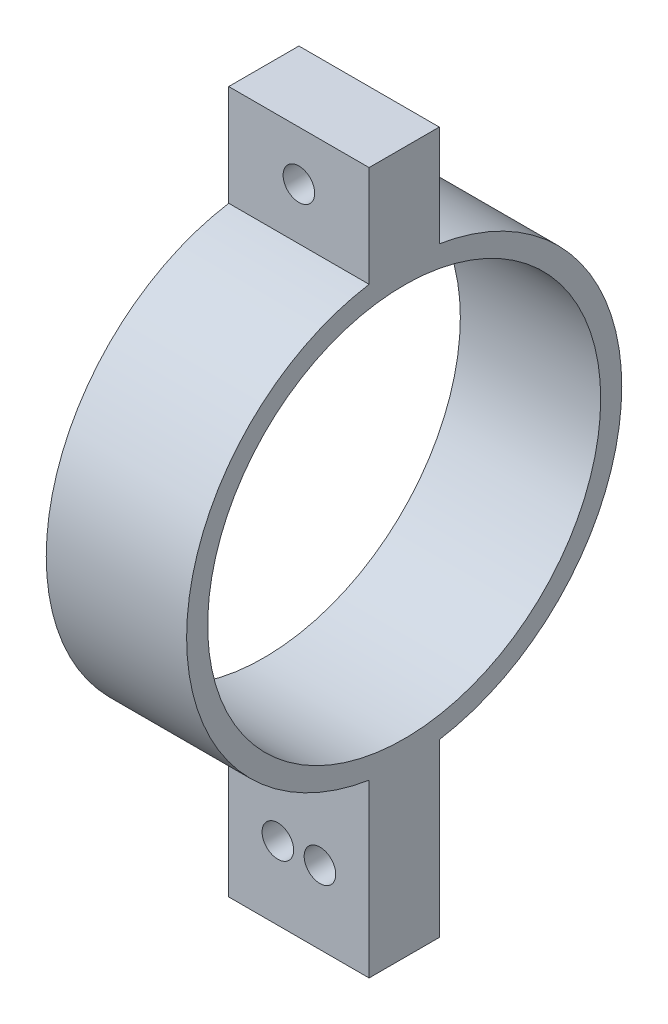
ISO-10303-21;
HEADER;
FILE_DESCRIPTION(('STEP AP214'),'2;1');
FILE_NAME('part.step','',(''),(''),'','','');
FILE_SCHEMA(('AUTOMOTIVE_DESIGN { 1 0 10303 214 1 1 1 1 }'));
ENDSEC;
DATA;
#1=APPLICATION_CONTEXT('core data for automotive mechanical design processes');
#2=APPLICATION_PROTOCOL_DEFINITION('international standard','automotive_design',2000,#1);
#3=PRODUCT_CONTEXT('',#1,'mechanical');
#4=PRODUCT('Part','Part','',(#3));
#5=PRODUCT_RELATED_PRODUCT_CATEGORY('part','',(#4));
#6=PRODUCT_DEFINITION_FORMATION('','',#4);
#7=PRODUCT_DEFINITION_CONTEXT('part definition',#1,'design');
#8=PRODUCT_DEFINITION('design','',#6,#7);
#9=PRODUCT_DEFINITION_SHAPE('','',#8);
#10=(LENGTH_UNIT() NAMED_UNIT(*) SI_UNIT(.MILLI.,.METRE.));
#11=(NAMED_UNIT(*) PLANE_ANGLE_UNIT() SI_UNIT($,.RADIAN.));
#12=(NAMED_UNIT(*) SI_UNIT($,.STERADIAN.) SOLID_ANGLE_UNIT());
#13=UNCERTAINTY_MEASURE_WITH_UNIT(LENGTH_MEASURE(1.E-05),#10,'distance_accuracy_value','');
#14=(GEOMETRIC_REPRESENTATION_CONTEXT(3) GLOBAL_UNCERTAINTY_ASSIGNED_CONTEXT((#13)) GLOBAL_UNIT_ASSIGNED_CONTEXT((#10,
#11,#12)) REPRESENTATION_CONTEXT('',''));
#15=CARTESIAN_POINT('',(0.,0.,0.));
#16=DIRECTION('',(0.,0.,1.));
#17=DIRECTION('',(1.,0.,0.));
#18=AXIS2_PLACEMENT_3D('',#15,#16,#17);
#19=CARTESIAN_POINT('',(20.,0.,0.));
#20=DIRECTION('',(-1.,0.,0.));
#21=DIRECTION('',(0.,0.,1.));
#22=AXIS2_PLACEMENT_3D('',#19,#20,#21);
#23=CYLINDRICAL_SURFACE('',#22,28.);
#24=CARTESIAN_POINT('',(0.,0.,0.));
#25=DIRECTION('',(1.,0.,0.));
#26=DIRECTION('',(0.,0.,-1.));
#27=AXIS2_PLACEMENT_3D('',#24,#25,#26);
#28=CIRCLE('',#27,28.);
#29=CARTESIAN_POINT('',(0.,0.,-28.));
#30=VERTEX_POINT('',#29);
#31=EDGE_CURVE('E163',#30,#30,#28,.T.);
#32=ORIENTED_EDGE('',*,*,#31,.F.);
#33=EDGE_LOOP('',(#32));
#34=FACE_BOUND('',#33,.T.);
#35=CARTESIAN_POINT('',(20.,0.,0.));
#36=DIRECTION('',(1.,0.,0.));
#37=DIRECTION('',(0.,0.,-1.));
#38=AXIS2_PLACEMENT_3D('',#35,#36,#37);
#39=CIRCLE('',#38,28.);
#40=CARTESIAN_POINT('',(20.,0.,-28.));
#41=VERTEX_POINT('',#40);
#42=EDGE_CURVE('E164',#41,#41,#39,.T.);
#43=ORIENTED_EDGE('',*,*,#42,.T.);
#44=EDGE_LOOP('',(#43));
#45=FACE_BOUND('',#44,.T.);
#46=ADVANCED_FACE('F40',(#34,#45),#23,.F.);
#47=CARTESIAN_POINT('',(20.,45.,0.));
#48=DIRECTION('',(0.,-1.,0.));
#49=DIRECTION('',(0.,0.,-1.));
#50=AXIS2_PLACEMENT_3D('',#47,#48,#49);
#51=PLANE('',#50);
#52=DIRECTION('',(0.,0.,1.));
#53=VECTOR('',#52,1.);
#54=CARTESIAN_POINT('',(0.,45.,0.));
#55=LINE('',#54,#53);
#56=CARTESIAN_POINT('',(0.,45.,-5.));
#57=VERTEX_POINT('',#56);
#58=CARTESIAN_POINT('',(0.,45.,5.));
#59=VERTEX_POINT('',#58);
#60=EDGE_CURVE('E177',#57,#59,#55,.T.);
#61=ORIENTED_EDGE('',*,*,#60,.T.);
#62=DIRECTION('',(-1.,0.,0.));
#63=VECTOR('',#62,1.);
#64=CARTESIAN_POINT('',(20.,45.,5.));
#65=LINE('',#64,#63);
#66=CARTESIAN_POINT('',(20.,45.,5.));
#67=VERTEX_POINT('',#66);
#68=EDGE_CURVE('E11',#67,#59,#65,.T.);
#69=ORIENTED_EDGE('',*,*,#68,.F.);
#70=DIRECTION('',(0.,0.,1.));
#71=VECTOR('',#70,1.);
#72=CARTESIAN_POINT('',(20.,45.,0.));
#73=LINE('',#72,#71);
#74=CARTESIAN_POINT('',(20.,45.,-5.));
#75=VERTEX_POINT('',#74);
#76=EDGE_CURVE('E78',#75,#67,#73,.T.);
#77=ORIENTED_EDGE('',*,*,#76,.F.);
#78=DIRECTION('',(-1.,0.,0.));
#79=VECTOR('',#78,1.);
#80=CARTESIAN_POINT('',(20.,45.,-5.));
#81=LINE('',#80,#79);
#82=EDGE_CURVE('E149',#75,#57,#81,.T.);
#83=ORIENTED_EDGE('',*,*,#82,.T.);
#84=EDGE_LOOP('',(#61,#69,#77,#83));
#85=FACE_BOUND('',#84,.T.);
#86=ADVANCED_FACE('F202',(#85),#51,.F.);
#87=CARTESIAN_POINT('',(20.,0.,5.));
#88=DIRECTION('',(0.,0.,1.));
#89=DIRECTION('',(1.,0.,0.));
#90=AXIS2_PLACEMENT_3D('',#87,#88,#89);
#91=PLANE('',#90);
#92=CARTESIAN_POINT('',(10.,37.9474264753674,5.));
#93=DIRECTION('',(0.,0.,1.));
#94=DIRECTION('',(-1.,0.,0.));
#95=AXIS2_PLACEMENT_3D('',#92,#93,#94);
#96=CIRCLE('',#95,2.25);
#97=CARTESIAN_POINT('',(7.75,37.9474264753674,5.));
#98=VERTEX_POINT('',#97);
#99=EDGE_CURVE('E153',#98,#98,#96,.T.);
#100=ORIENTED_EDGE('',*,*,#99,.F.);
#101=EDGE_LOOP('',(#100));
#102=FACE_BOUND('',#101,.T.);
#103=DIRECTION('',(0.,1.,0.));
#104=VECTOR('',#103,1.);
#105=CARTESIAN_POINT('',(0.,0.,5.));
#106=LINE('',#105,#104);
#107=CARTESIAN_POINT('',(0.,30.5941170815567,5.));
#108=VERTEX_POINT('',#107);
#109=EDGE_CURVE('E180',#108,#59,#106,.T.);
#110=ORIENTED_EDGE('',*,*,#109,.F.);
#111=DIRECTION('',(-1.,0.,0.));
#112=VECTOR('',#111,1.);
#113=CARTESIAN_POINT('',(20.,30.5941170815567,5.));
#114=LINE('',#113,#112);
#115=CARTESIAN_POINT('',(20.,30.5941170815567,5.));
#116=VERTEX_POINT('',#115);
#117=EDGE_CURVE('E48',#116,#108,#114,.T.);
#118=ORIENTED_EDGE('',*,*,#117,.F.);
#119=DIRECTION('',(0.,1.,0.));
#120=VECTOR('',#119,1.);
#121=CARTESIAN_POINT('',(20.,0.,5.));
#122=LINE('',#121,#120);
#123=EDGE_CURVE('E169',#116,#67,#122,.T.);
#124=ORIENTED_EDGE('',*,*,#123,.T.);
#125=ORIENTED_EDGE('',*,*,#68,.T.);
#126=EDGE_LOOP('',(#110,#118,#124,#125));
#127=FACE_BOUND('',#126,.T.);
#128=ADVANCED_FACE('F204',(#102,#127),#91,.T.);
#129=CARTESIAN_POINT('',(20.,0.,0.));
#130=DIRECTION('',(-1.,0.,0.));
#131=DIRECTION('',(0.,0.,1.));
#132=AXIS2_PLACEMENT_3D('',#129,#130,#131);
#133=CYLINDRICAL_SURFACE('',#132,31.);
#134=CARTESIAN_POINT('',(0.,0.,0.));
#135=DIRECTION('',(1.,0.,0.));
#136=DIRECTION('',(0.,0.,-1.));
#137=AXIS2_PLACEMENT_3D('',#134,#135,#136);
#138=CIRCLE('',#137,31.);
#139=CARTESIAN_POINT('',(0.,-30.5941170815567,5.));
#140=VERTEX_POINT('',#139);
#141=EDGE_CURVE('E183',#108,#140,#138,.T.);
#142=ORIENTED_EDGE('',*,*,#141,.T.);
#143=DIRECTION('',(-1.,0.,0.));
#144=VECTOR('',#143,1.);
#145=CARTESIAN_POINT('',(20.,-30.5941170815567,5.));
#146=LINE('',#145,#144);
#147=CARTESIAN_POINT('',(20.,-30.5941170815567,5.));
#148=VERTEX_POINT('',#147);
#149=EDGE_CURVE('E74',#148,#140,#146,.T.);
#150=ORIENTED_EDGE('',*,*,#149,.F.);
#151=CARTESIAN_POINT('',(20.,0.,0.));
#152=DIRECTION('',(1.,0.,0.));
#153=DIRECTION('',(0.,0.,-1.));
#154=AXIS2_PLACEMENT_3D('',#151,#152,#153);
#155=CIRCLE('',#154,31.);
#156=EDGE_CURVE('E56',#116,#148,#155,.T.);
#157=ORIENTED_EDGE('',*,*,#156,.F.);
#158=ORIENTED_EDGE('',*,*,#117,.T.);
#159=EDGE_LOOP('',(#142,#150,#157,#158));
#160=FACE_BOUND('',#159,.T.);
#161=ADVANCED_FACE('F205',(#160),#133,.T.);
#162=CARTESIAN_POINT('',(20.,0.,5.));
#163=DIRECTION('',(0.,0.,1.));
#164=DIRECTION('',(1.,0.,0.));
#165=AXIS2_PLACEMENT_3D('',#162,#163,#164);
#166=PLANE('',#165);
#167=CARTESIAN_POINT('',(13.,-44.5941170815567,5.));
#168=DIRECTION('',(0.,0.,1.));
#169=DIRECTION('',(1.,0.,0.));
#170=AXIS2_PLACEMENT_3D('',#167,#168,#169);
#171=CIRCLE('',#170,2.25);
#172=CARTESIAN_POINT('',(15.25,-44.5941170815567,5.));
#173=VERTEX_POINT('',#172);
#174=EDGE_CURVE('E152',#173,#173,#171,.T.);
#175=ORIENTED_EDGE('',*,*,#174,.F.);
#176=EDGE_LOOP('',(#175));
#177=FACE_BOUND('',#176,.T.);
#178=CARTESIAN_POINT('',(7.,-44.5941170815567,5.));
#179=DIRECTION('',(0.,0.,1.));
#180=DIRECTION('',(1.,0.,0.));
#181=AXIS2_PLACEMENT_3D('',#178,#179,#180);
#182=CIRCLE('',#181,2.25000000000001);
#183=CARTESIAN_POINT('',(9.25000000000001,-44.5941170815567,5.));
#184=VERTEX_POINT('',#183);
#185=EDGE_CURVE('E156',#184,#184,#182,.T.);
#186=ORIENTED_EDGE('',*,*,#185,.F.);
#187=EDGE_LOOP('',(#186));
#188=FACE_BOUND('',#187,.T.);
#189=DIRECTION('',(0.,1.,0.));
#190=VECTOR('',#189,1.);
#191=CARTESIAN_POINT('',(0.,0.,5.));
#192=LINE('',#191,#190);
#193=CARTESIAN_POINT('',(0.,-55.,5.));
#194=VERTEX_POINT('',#193);
#195=EDGE_CURVE('E167',#194,#140,#192,.T.);
#196=ORIENTED_EDGE('',*,*,#195,.F.);
#197=DIRECTION('',(-1.,0.,0.));
#198=VECTOR('',#197,1.);
#199=CARTESIAN_POINT('',(20.,-55.,5.));
#200=LINE('',#199,#198);
#201=CARTESIAN_POINT('',(20.,-55.,5.));
#202=VERTEX_POINT('',#201);
#203=EDGE_CURVE('E117',#202,#194,#200,.T.);
#204=ORIENTED_EDGE('',*,*,#203,.F.);
#205=DIRECTION('',(0.,1.,0.));
#206=VECTOR('',#205,1.);
#207=CARTESIAN_POINT('',(20.,0.,5.));
#208=LINE('',#207,#206);
#209=EDGE_CURVE('E173',#202,#148,#208,.T.);
#210=ORIENTED_EDGE('',*,*,#209,.T.);
#211=ORIENTED_EDGE('',*,*,#149,.T.);
#212=EDGE_LOOP('',(#196,#204,#210,#211));
#213=FACE_BOUND('',#212,.T.);
#214=ADVANCED_FACE('F187',(#177,#188,#213),#166,.T.);
#215=CARTESIAN_POINT('',(20.,0.,0.));
#216=DIRECTION('',(1.,0.,0.));
#217=DIRECTION('',(0.,0.,-1.));
#218=AXIS2_PLACEMENT_3D('',#215,#216,#217);
#219=PLANE('',#218);
#220=DIRECTION('',(0.,1.,0.));
#221=VECTOR('',#220,1.);
#222=CARTESIAN_POINT('',(20.,0.,-5.));
#223=LINE('',#222,#221);
#224=CARTESIAN_POINT('',(20.,30.5941170815567,-5.));
#225=VERTEX_POINT('',#224);
#226=EDGE_CURVE('E137',#225,#75,#223,.T.);
#227=ORIENTED_EDGE('',*,*,#226,.T.);
#228=ORIENTED_EDGE('',*,*,#76,.T.);
#229=ORIENTED_EDGE('',*,*,#123,.F.);
#230=ORIENTED_EDGE('',*,*,#156,.T.);
#231=ORIENTED_EDGE('',*,*,#209,.F.);
#232=DIRECTION('',(0.,0.,1.));
#233=VECTOR('',#232,1.);
#234=CARTESIAN_POINT('',(20.,-55.,0.));
#235=LINE('',#234,#233);
#236=CARTESIAN_POINT('',(20.,-55.,-5.));
#237=VERTEX_POINT('',#236);
#238=EDGE_CURVE('E121',#237,#202,#235,.T.);
#239=ORIENTED_EDGE('',*,*,#238,.F.);
#240=DIRECTION('',(0.,1.,0.));
#241=VECTOR('',#240,1.);
#242=CARTESIAN_POINT('',(20.,0.,-5.));
#243=LINE('',#242,#241);
#244=CARTESIAN_POINT('',(20.,-30.5941170815567,-5.));
#245=VERTEX_POINT('',#244);
#246=EDGE_CURVE('E128',#237,#245,#243,.T.);
#247=ORIENTED_EDGE('',*,*,#246,.T.);
#248=CARTESIAN_POINT('',(20.,0.,0.));
#249=DIRECTION('',(-1.,0.,0.));
#250=DIRECTION('',(0.,0.,1.));
#251=AXIS2_PLACEMENT_3D('',#248,#249,#250);
#252=CIRCLE('',#251,31.);
#253=EDGE_CURVE('E139',#225,#245,#252,.T.);
#254=ORIENTED_EDGE('',*,*,#253,.F.);
#255=EDGE_LOOP('',(#227,#228,#229,#230,#231,#239,#247,#254));
#256=FACE_BOUND('',#255,.T.);
#257=ORIENTED_EDGE('',*,*,#42,.F.);
#258=EDGE_LOOP('',(#257));
#259=FACE_BOUND('',#258,.T.);
#260=ADVANCED_FACE('F188',(#256,#259),#219,.T.);
#261=CARTESIAN_POINT('',(0.,0.,0.));
#262=DIRECTION('',(1.,0.,0.));
#263=DIRECTION('',(0.,0.,-1.));
#264=AXIS2_PLACEMENT_3D('',#261,#262,#263);
#265=PLANE('',#264);
#266=ORIENTED_EDGE('',*,*,#60,.F.);
#267=DIRECTION('',(0.,1.,0.));
#268=VECTOR('',#267,1.);
#269=CARTESIAN_POINT('',(0.,0.,-5.));
#270=LINE('',#269,#268);
#271=CARTESIAN_POINT('',(0.,30.5941170815567,-5.));
#272=VERTEX_POINT('',#271);
#273=EDGE_CURVE('E129',#272,#57,#270,.T.);
#274=ORIENTED_EDGE('',*,*,#273,.F.);
#275=CARTESIAN_POINT('',(0.,0.,0.));
#276=DIRECTION('',(-1.,0.,0.));
#277=DIRECTION('',(0.,0.,1.));
#278=AXIS2_PLACEMENT_3D('',#275,#276,#277);
#279=CIRCLE('',#278,31.);
#280=CARTESIAN_POINT('',(0.,-30.5941170815567,-5.));
#281=VERTEX_POINT('',#280);
#282=EDGE_CURVE('E136',#272,#281,#279,.T.);
#283=ORIENTED_EDGE('',*,*,#282,.T.);
#284=DIRECTION('',(0.,1.,0.));
#285=VECTOR('',#284,1.);
#286=CARTESIAN_POINT('',(0.,0.,-5.));
#287=LINE('',#286,#285);
#288=CARTESIAN_POINT('',(0.,-55.,-5.));
#289=VERTEX_POINT('',#288);
#290=EDGE_CURVE('E126',#289,#281,#287,.T.);
#291=ORIENTED_EDGE('',*,*,#290,.F.);
#292=DIRECTION('',(0.,0.,-1.));
#293=VECTOR('',#292,1.);
#294=CARTESIAN_POINT('',(0.,-55.,5.));
#295=LINE('',#294,#293);
#296=EDGE_CURVE('E110',#194,#289,#295,.T.);
#297=ORIENTED_EDGE('',*,*,#296,.F.);
#298=ORIENTED_EDGE('',*,*,#195,.T.);
#299=ORIENTED_EDGE('',*,*,#141,.F.);
#300=ORIENTED_EDGE('',*,*,#109,.T.);
#301=EDGE_LOOP('',(#266,#274,#283,#291,#297,#298,#299,#300));
#302=FACE_BOUND('',#301,.T.);
#303=ORIENTED_EDGE('',*,*,#31,.T.);
#304=EDGE_LOOP('',(#303));
#305=FACE_BOUND('',#304,.T.);
#306=ADVANCED_FACE('F133',(#302,#305),#265,.F.);
#307=CARTESIAN_POINT('',(0.,-55.,0.));
#308=DIRECTION('',(0.,-1.,0.));
#309=DIRECTION('',(0.,0.,-1.));
#310=AXIS2_PLACEMENT_3D('',#307,#308,#309);
#311=PLANE('',#310);
#312=ORIENTED_EDGE('',*,*,#203,.T.);
#313=ORIENTED_EDGE('',*,*,#296,.T.);
#314=DIRECTION('',(-1.,0.,0.));
#315=VECTOR('',#314,1.);
#316=CARTESIAN_POINT('',(20.,-55.,-5.));
#317=LINE('',#316,#315);
#318=EDGE_CURVE('E114',#237,#289,#317,.T.);
#319=ORIENTED_EDGE('',*,*,#318,.F.);
#320=ORIENTED_EDGE('',*,*,#238,.T.);
#321=EDGE_LOOP('',(#312,#313,#319,#320));
#322=FACE_BOUND('',#321,.T.);
#323=ADVANCED_FACE('F112',(#322),#311,.T.);
#324=CARTESIAN_POINT('',(7.,-44.5941170815567,-5.));
#325=DIRECTION('',(0.,0.,1.));
#326=DIRECTION('',(1.,0.,0.));
#327=AXIS2_PLACEMENT_3D('',#324,#325,#326);
#328=CYLINDRICAL_SURFACE('',#327,2.25000000000001);
#329=ORIENTED_EDGE('',*,*,#185,.T.);
#330=EDGE_LOOP('',(#329));
#331=FACE_BOUND('',#330,.T.);
#332=CARTESIAN_POINT('',(7.,-44.5941170815567,-5.));
#333=DIRECTION('',(0.,0.,1.));
#334=DIRECTION('',(1.,0.,0.));
#335=AXIS2_PLACEMENT_3D('',#332,#333,#334);
#336=CIRCLE('',#335,2.25000000000001);
#337=CARTESIAN_POINT('',(9.25000000000001,-44.5941170815567,-5.));
#338=VERTEX_POINT('',#337);
#339=EDGE_CURVE('E130',#338,#338,#336,.T.);
#340=ORIENTED_EDGE('',*,*,#339,.F.);
#341=EDGE_LOOP('',(#340));
#342=FACE_BOUND('',#341,.T.);
#343=ADVANCED_FACE('F234',(#331,#342),#328,.F.);
#344=CARTESIAN_POINT('',(13.,-44.5941170815567,-5.));
#345=DIRECTION('',(0.,0.,1.));
#346=DIRECTION('',(1.,0.,0.));
#347=AXIS2_PLACEMENT_3D('',#344,#345,#346);
#348=CYLINDRICAL_SURFACE('',#347,2.25);
#349=ORIENTED_EDGE('',*,*,#174,.T.);
#350=EDGE_LOOP('',(#349));
#351=FACE_BOUND('',#350,.T.);
#352=CARTESIAN_POINT('',(13.,-44.5941170815567,-5.));
#353=DIRECTION('',(0.,0.,1.));
#354=DIRECTION('',(1.,0.,0.));
#355=AXIS2_PLACEMENT_3D('',#352,#353,#354);
#356=CIRCLE('',#355,2.25);
#357=CARTESIAN_POINT('',(15.25,-44.5941170815567,-5.));
#358=VERTEX_POINT('',#357);
#359=EDGE_CURVE('E258',#358,#358,#356,.T.);
#360=ORIENTED_EDGE('',*,*,#359,.F.);
#361=EDGE_LOOP('',(#360));
#362=FACE_BOUND('',#361,.T.);
#363=ADVANCED_FACE('F237',(#351,#362),#348,.F.);
#364=CARTESIAN_POINT('',(10.,37.9474264753674,-5.));
#365=DIRECTION('',(0.,0.,1.));
#366=DIRECTION('',(1.,0.,0.));
#367=AXIS2_PLACEMENT_3D('',#364,#365,#366);
#368=CYLINDRICAL_SURFACE('',#367,2.25);
#369=ORIENTED_EDGE('',*,*,#99,.T.);
#370=EDGE_LOOP('',(#369));
#371=FACE_BOUND('',#370,.T.);
#372=CARTESIAN_POINT('',(10.,37.9474264753674,-5.));
#373=DIRECTION('',(0.,0.,1.));
#374=DIRECTION('',(-1.,0.,0.));
#375=AXIS2_PLACEMENT_3D('',#372,#373,#374);
#376=CIRCLE('',#375,2.25);
#377=CARTESIAN_POINT('',(7.75,37.9474264753674,-5.));
#378=VERTEX_POINT('',#377);
#379=EDGE_CURVE('E262',#378,#378,#376,.T.);
#380=ORIENTED_EDGE('',*,*,#379,.F.);
#381=EDGE_LOOP('',(#380));
#382=FACE_BOUND('',#381,.T.);
#383=ADVANCED_FACE('F241',(#371,#382),#368,.F.);
#384=CARTESIAN_POINT('',(20.,0.,-5.));
#385=DIRECTION('',(0.,0.,-1.));
#386=DIRECTION('',(1.,0.,0.));
#387=AXIS2_PLACEMENT_3D('',#384,#385,#386);
#388=PLANE('',#387);
#389=ORIENTED_EDGE('',*,*,#379,.T.);
#390=EDGE_LOOP('',(#389));
#391=FACE_BOUND('',#390,.T.);
#392=ORIENTED_EDGE('',*,*,#273,.T.);
#393=ORIENTED_EDGE('',*,*,#82,.F.);
#394=ORIENTED_EDGE('',*,*,#226,.F.);
#395=DIRECTION('',(-1.,0.,0.));
#396=VECTOR('',#395,1.);
#397=CARTESIAN_POINT('',(20.,30.5941170815567,-5.));
#398=LINE('',#397,#396);
#399=EDGE_CURVE('E146',#225,#272,#398,.T.);
#400=ORIENTED_EDGE('',*,*,#399,.T.);
#401=EDGE_LOOP('',(#392,#393,#394,#400));
#402=FACE_BOUND('',#401,.T.);
#403=ADVANCED_FACE('F200',(#391,#402),#388,.T.);
#404=CARTESIAN_POINT('',(20.,0.,0.));
#405=DIRECTION('',(-1.,0.,0.));
#406=DIRECTION('',(0.,0.,-1.));
#407=AXIS2_PLACEMENT_3D('',#404,#405,#406);
#408=CYLINDRICAL_SURFACE('',#407,31.);
#409=ORIENTED_EDGE('',*,*,#282,.F.);
#410=ORIENTED_EDGE('',*,*,#399,.F.);
#411=ORIENTED_EDGE('',*,*,#253,.T.);
#412=DIRECTION('',(-1.,0.,0.));
#413=VECTOR('',#412,1.);
#414=CARTESIAN_POINT('',(20.,-30.5941170815567,-5.));
#415=LINE('',#414,#413);
#416=EDGE_CURVE('E144',#245,#281,#415,.T.);
#417=ORIENTED_EDGE('',*,*,#416,.T.);
#418=EDGE_LOOP('',(#409,#410,#411,#417));
#419=FACE_BOUND('',#418,.T.);
#420=ADVANCED_FACE('F194',(#419),#408,.T.);
#421=CARTESIAN_POINT('',(20.,0.,-5.));
#422=DIRECTION('',(0.,0.,-1.));
#423=DIRECTION('',(1.,0.,0.));
#424=AXIS2_PLACEMENT_3D('',#421,#422,#423);
#425=PLANE('',#424);
#426=ORIENTED_EDGE('',*,*,#359,.T.);
#427=EDGE_LOOP('',(#426));
#428=FACE_BOUND('',#427,.T.);
#429=ORIENTED_EDGE('',*,*,#339,.T.);
#430=EDGE_LOOP('',(#429));
#431=FACE_BOUND('',#430,.T.);
#432=ORIENTED_EDGE('',*,*,#290,.T.);
#433=ORIENTED_EDGE('',*,*,#416,.F.);
#434=ORIENTED_EDGE('',*,*,#246,.F.);
#435=ORIENTED_EDGE('',*,*,#318,.T.);
#436=EDGE_LOOP('',(#432,#433,#434,#435));
#437=FACE_BOUND('',#436,.T.);
#438=ADVANCED_FACE('F124',(#428,#431,#437),#425,.T.);
#439=CLOSED_SHELL('',(#46,#86,#128,#161,#214,#260,#306,#323,#343,#363,#383,#403,#420,#438));
#440=MANIFOLD_SOLID_BREP('B2',#439);
#441=ADVANCED_BREP_SHAPE_REPRESENTATION('',(#18,#440),#14);
#442=SHAPE_DEFINITION_REPRESENTATION(#9,#441);
ENDSEC;
END-ISO-10303-21;
